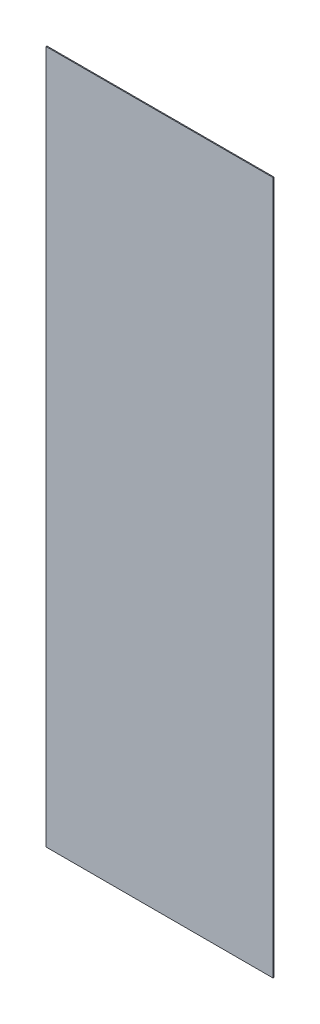
ISO-10303-21;
HEADER;
FILE_DESCRIPTION(('STEP AP214'),'2;1');
FILE_NAME('part.step','',(''),(''),'','','');
FILE_SCHEMA(('AUTOMOTIVE_DESIGN { 1 0 10303 214 1 1 1 1 }'));
ENDSEC;
DATA;
#1=APPLICATION_CONTEXT('core data for automotive mechanical design processes');
#2=APPLICATION_PROTOCOL_DEFINITION('international standard','automotive_design',2000,#1);
#3=PRODUCT_CONTEXT('',#1,'mechanical');
#4=PRODUCT('Part','Part','',(#3));
#5=PRODUCT_RELATED_PRODUCT_CATEGORY('part','',(#4));
#6=PRODUCT_DEFINITION_FORMATION('','',#4);
#7=PRODUCT_DEFINITION_CONTEXT('part definition',#1,'design');
#8=PRODUCT_DEFINITION('design','',#6,#7);
#9=PRODUCT_DEFINITION_SHAPE('','',#8);
#10=(LENGTH_UNIT() NAMED_UNIT(*) SI_UNIT(.MILLI.,.METRE.));
#11=(NAMED_UNIT(*) PLANE_ANGLE_UNIT() SI_UNIT($,.RADIAN.));
#12=(NAMED_UNIT(*) SI_UNIT($,.STERADIAN.) SOLID_ANGLE_UNIT());
#13=UNCERTAINTY_MEASURE_WITH_UNIT(LENGTH_MEASURE(1.E-05),#10,'distance_accuracy_value','');
#14=(GEOMETRIC_REPRESENTATION_CONTEXT(3) GLOBAL_UNCERTAINTY_ASSIGNED_CONTEXT((#13)) GLOBAL_UNIT_ASSIGNED_CONTEXT((#10,
#11,#12)) REPRESENTATION_CONTEXT('',''));
#15=CARTESIAN_POINT('',(0.,0.,0.));
#16=DIRECTION('',(0.,0.,1.));
#17=DIRECTION('',(1.,0.,0.));
#18=AXIS2_PLACEMENT_3D('',#15,#16,#17);
#19=CARTESIAN_POINT('',(160.305709023941,-3.1365868631062,0.002));
#20=DIRECTION('',(0.,1.,0.));
#21=DIRECTION('',(0.,0.,1.));
#22=AXIS2_PLACEMENT_3D('',#19,#20,#21);
#23=PLANE('',#22);
#24=CARTESIAN_POINT('',(160.305709023941,-3.1365868631062,0.));
#25=CARTESIAN_POINT('',(160.47022713321,-3.1365868631062,0.));
#26=CARTESIAN_POINT('',(160.63474524248,-3.1365868631062,0.));
#27=CARTESIAN_POINT('',(160.799263351749,-3.1365868631062,0.));
#28=B_SPLINE_CURVE_WITH_KNOTS('',3,(#24,#25,#26,#27),.UNSPECIFIED.,.F.,.F.,(4,4),(0.,
0.123262469337697),.UNSPECIFIED.);
#29=CARTESIAN_POINT('',(160.305709023941,-3.1365868631062,0.));
#30=VERTEX_POINT('',#29);
#31=CARTESIAN_POINT('',(160.799263351749,-3.1365868631062,0.));
#32=VERTEX_POINT('',#31);
#33=EDGE_CURVE('E66',#30,#32,#28,.T.);
#34=ORIENTED_EDGE('',*,*,#33,.T.);
#35=DIRECTION('',(0.,0.,-1.));
#36=VECTOR('',#35,1.);
#37=CARTESIAN_POINT('',(160.799263351749,-3.1365868631062,0.002));
#38=LINE('',#37,#36);
#39=CARTESIAN_POINT('',(160.799263351749,-3.1365868631062,0.002));
#40=VERTEX_POINT('',#39);
#41=EDGE_CURVE('E74',#40,#32,#38,.T.);
#42=ORIENTED_EDGE('',*,*,#41,.F.);
#43=CARTESIAN_POINT('',(160.305709023941,-3.1365868631062,0.002));
#44=CARTESIAN_POINT('',(160.47022713321,-3.1365868631062,0.002));
#45=CARTESIAN_POINT('',(160.63474524248,-3.1365868631062,0.002));
#46=CARTESIAN_POINT('',(160.799263351749,-3.1365868631062,0.002));
#47=B_SPLINE_CURVE_WITH_KNOTS('',3,(#43,#44,#45,#46),.UNSPECIFIED.,.F.,.F.,(4,4),(0.,
0.123262469337697),.UNSPECIFIED.);
#48=CARTESIAN_POINT('',(160.305709023941,-3.1365868631062,0.002));
#49=VERTEX_POINT('',#48);
#50=EDGE_CURVE('E79',#49,#40,#47,.T.);
#51=ORIENTED_EDGE('',*,*,#50,.F.);
#52=DIRECTION('',(0.,0.,-1.));
#53=VECTOR('',#52,1.);
#54=CARTESIAN_POINT('',(160.305709023941,-3.1365868631062,0.002));
#55=LINE('',#54,#53);
#56=EDGE_CURVE('E71',#49,#30,#55,.T.);
#57=ORIENTED_EDGE('',*,*,#56,.T.);
#58=EDGE_LOOP('',(#34,#42,#51,#57));
#59=FACE_BOUND('',#58,.T.);
#60=ADVANCED_FACE('F17',(#59),#23,.F.);
#61=CARTESIAN_POINT('',(160.799263351749,-3.1365868631062,0.002));
#62=DIRECTION('',(-1.,0.,0.));
#63=DIRECTION('',(0.,0.,1.));
#64=AXIS2_PLACEMENT_3D('',#61,#62,#63);
#65=PLANE('',#64);
#66=CARTESIAN_POINT('',(160.799263351749,-3.1365868631062,0.));
#67=CARTESIAN_POINT('',(160.799263351749,-2.63375622399563,0.));
#68=CARTESIAN_POINT('',(160.799263351749,-2.13092558488507,0.));
#69=CARTESIAN_POINT('',(160.799263351749,-1.62809494577451,0.));
#70=B_SPLINE_CURVE_WITH_KNOTS('',3,(#66,#67,#68,#69),.UNSPECIFIED.,.F.,.F.,(4,4),
(0.123262469337697,0.5),.UNSPECIFIED.);
#71=CARTESIAN_POINT('',(160.799263351749,-1.62809494577451,0.));
#72=VERTEX_POINT('',#71);
#73=EDGE_CURVE('E63',#32,#72,#70,.T.);
#74=ORIENTED_EDGE('',*,*,#73,.T.);
#75=DIRECTION('',(0.,0.,-1.));
#76=VECTOR('',#75,1.);
#77=CARTESIAN_POINT('',(160.799263351749,-1.62809494577451,0.002));
#78=LINE('',#77,#76);
#79=CARTESIAN_POINT('',(160.799263351749,-1.62809494577451,0.002));
#80=VERTEX_POINT('',#79);
#81=EDGE_CURVE('E70',#80,#72,#78,.T.);
#82=ORIENTED_EDGE('',*,*,#81,.F.);
#83=CARTESIAN_POINT('',(160.799263351749,-3.1365868631062,0.002));
#84=CARTESIAN_POINT('',(160.799263351749,-2.63375622399563,0.002));
#85=CARTESIAN_POINT('',(160.799263351749,-2.13092558488507,0.002));
#86=CARTESIAN_POINT('',(160.799263351749,-1.62809494577451,0.002));
#87=B_SPLINE_CURVE_WITH_KNOTS('',3,(#83,#84,#85,#86),.UNSPECIFIED.,.F.,.F.,(4,4),
(0.123262469337697,0.5),.UNSPECIFIED.);
#88=EDGE_CURVE('E57',#40,#80,#87,.T.);
#89=ORIENTED_EDGE('',*,*,#88,.F.);
#90=ORIENTED_EDGE('',*,*,#41,.T.);
#91=EDGE_LOOP('',(#74,#82,#89,#90));
#92=FACE_BOUND('',#91,.T.);
#93=ADVANCED_FACE('F75',(#92),#65,.F.);
#94=CARTESIAN_POINT('',(160.799263351749,-1.62809494577451,0.002));
#95=DIRECTION('',(0.,-1.,0.));
#96=DIRECTION('',(0.,0.,-1.));
#97=AXIS2_PLACEMENT_3D('',#94,#95,#96);
#98=PLANE('',#97);
#99=CARTESIAN_POINT('',(160.799263351749,-1.62809494577451,0.));
#100=CARTESIAN_POINT('',(160.63474524248,-1.62809494577451,0.));
#101=CARTESIAN_POINT('',(160.47022713321,-1.62809494577451,0.));
#102=CARTESIAN_POINT('',(160.305709023941,-1.62809494577451,0.));
#103=B_SPLINE_CURVE_WITH_KNOTS('',3,(#99,#100,#101,#102),.UNSPECIFIED.,.F.,.F.,(4,4),(0.5,
0.623262469337694),.UNSPECIFIED.);
#104=CARTESIAN_POINT('',(160.305709023941,-1.62809494577451,0.));
#105=VERTEX_POINT('',#104);
#106=EDGE_CURVE('E67',#72,#105,#103,.T.);
#107=ORIENTED_EDGE('',*,*,#106,.T.);
#108=DIRECTION('',(0.,0.,-1.));
#109=VECTOR('',#108,1.);
#110=CARTESIAN_POINT('',(160.305709023941,-1.62809494577451,0.002));
#111=LINE('',#110,#109);
#112=CARTESIAN_POINT('',(160.305709023941,-1.62809494577451,0.002));
#113=VERTEX_POINT('',#112);
#114=EDGE_CURVE('E126',#113,#105,#111,.T.);
#115=ORIENTED_EDGE('',*,*,#114,.F.);
#116=CARTESIAN_POINT('',(160.799263351749,-1.62809494577451,0.002));
#117=CARTESIAN_POINT('',(160.63474524248,-1.62809494577451,0.002));
#118=CARTESIAN_POINT('',(160.47022713321,-1.62809494577451,0.002));
#119=CARTESIAN_POINT('',(160.305709023941,-1.62809494577451,0.002));
#120=B_SPLINE_CURVE_WITH_KNOTS('',3,(#116,#117,#118,#119),.UNSPECIFIED.,.F.,.F.,(4,4),(0.5,
0.623262469337694),.UNSPECIFIED.);
#121=EDGE_CURVE('E38',#80,#113,#120,.T.);
#122=ORIENTED_EDGE('',*,*,#121,.F.);
#123=ORIENTED_EDGE('',*,*,#81,.T.);
#124=EDGE_LOOP('',(#107,#115,#122,#123));
#125=FACE_BOUND('',#124,.T.);
#126=ADVANCED_FACE('F160',(#125),#98,.F.);
#127=CARTESIAN_POINT('',(160.305709023941,-1.62809494577451,0.002));
#128=DIRECTION('',(1.,0.,0.));
#129=DIRECTION('',(0.,1.,0.));
#130=AXIS2_PLACEMENT_3D('',#127,#128,#129);
#131=PLANE('',#130);
#132=CARTESIAN_POINT('',(160.305709023941,-1.62809494577451,0.));
#133=CARTESIAN_POINT('',(160.305709023941,-2.13092558488507,0.));
#134=CARTESIAN_POINT('',(160.305709023941,-2.63375622399563,0.));
#135=CARTESIAN_POINT('',(160.305709023941,-3.1365868631062,0.));
#136=B_SPLINE_CURVE_WITH_KNOTS('',3,(#132,#133,#134,#135),.UNSPECIFIED.,.F.,.F.,(4,4),
(0.623262469337694,1.),.UNSPECIFIED.);
#137=EDGE_CURVE('E30',#105,#30,#136,.T.);
#138=ORIENTED_EDGE('',*,*,#137,.T.);
#139=ORIENTED_EDGE('',*,*,#56,.F.);
#140=CARTESIAN_POINT('',(160.305709023941,-1.62809494577451,0.002));
#141=CARTESIAN_POINT('',(160.305709023941,-2.13092558488507,0.002));
#142=CARTESIAN_POINT('',(160.305709023941,-2.63375622399563,0.002));
#143=CARTESIAN_POINT('',(160.305709023941,-3.1365868631062,0.002));
#144=B_SPLINE_CURVE_WITH_KNOTS('',3,(#140,#141,#142,#143),.UNSPECIFIED.,.F.,.F.,(4,4),
(0.623262469337694,1.),.UNSPECIFIED.);
#145=EDGE_CURVE('E11',#113,#49,#144,.T.);
#146=ORIENTED_EDGE('',*,*,#145,.F.);
#147=ORIENTED_EDGE('',*,*,#114,.T.);
#148=EDGE_LOOP('',(#138,#139,#146,#147));
#149=FACE_BOUND('',#148,.T.);
#150=ADVANCED_FACE('F157',(#149),#131,.F.);
#151=CARTESIAN_POINT('',(160.552486187846,-3.1365868631062,0.002));
#152=DIRECTION('',(0.,0.,-1.));
#153=DIRECTION('',(-1.,0.,0.));
#154=AXIS2_PLACEMENT_3D('',#151,#152,#153);
#155=PLANE('',#154);
#156=ORIENTED_EDGE('',*,*,#50,.T.);
#157=ORIENTED_EDGE('',*,*,#88,.T.);
#158=ORIENTED_EDGE('',*,*,#121,.T.);
#159=ORIENTED_EDGE('',*,*,#145,.T.);
#160=EDGE_LOOP('',(#156,#157,#158,#159));
#161=FACE_BOUND('',#160,.T.);
#162=ADVANCED_FACE('F168',(#161),#155,.F.);
#163=CARTESIAN_POINT('',(160.552486187846,-3.1365868631062,0.));
#164=DIRECTION('',(0.,0.,-1.));
#165=DIRECTION('',(-1.,0.,0.));
#166=AXIS2_PLACEMENT_3D('',#163,#164,#165);
#167=PLANE('',#166);
#168=ORIENTED_EDGE('',*,*,#33,.F.);
#169=ORIENTED_EDGE('',*,*,#137,.F.);
#170=ORIENTED_EDGE('',*,*,#106,.F.);
#171=ORIENTED_EDGE('',*,*,#73,.F.);
#172=EDGE_LOOP('',(#168,#169,#170,#171));
#173=FACE_BOUND('',#172,.T.);
#174=ADVANCED_FACE('F19',(#173),#167,.T.);
#175=CLOSED_SHELL('',(#60,#93,#126,#150,#162,#174));
#176=MANIFOLD_SOLID_BREP('B1',#175);
#177=ADVANCED_BREP_SHAPE_REPRESENTATION('',(#18,#176),#14);
#178=SHAPE_DEFINITION_REPRESENTATION(#9,#177);
ENDSEC;
END-ISO-10303-21;
